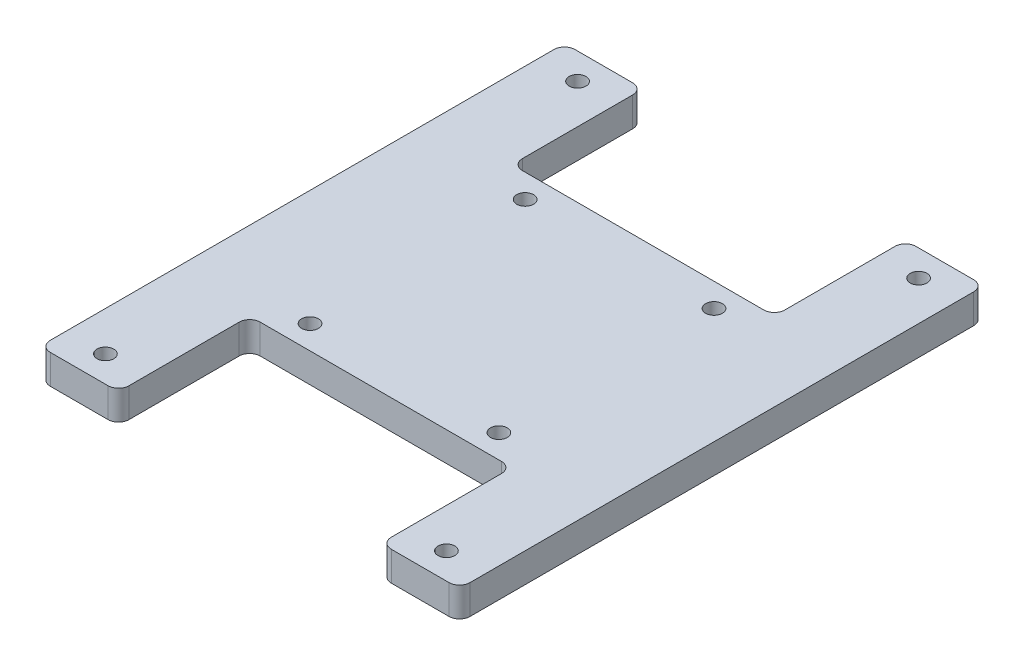
ISO-10303-21;
HEADER;
FILE_DESCRIPTION(('STEP AP214'),'2;1');
FILE_NAME('part.step','',(''),(''),'','','');
FILE_SCHEMA(('AUTOMOTIVE_DESIGN { 1 0 10303 214 1 1 1 1 }'));
ENDSEC;
DATA;
#1=APPLICATION_CONTEXT('core data for automotive mechanical design processes');
#2=APPLICATION_PROTOCOL_DEFINITION('international standard','automotive_design',2000,#1);
#3=PRODUCT_CONTEXT('',#1,'mechanical');
#4=PRODUCT('Part','Part','',(#3));
#5=PRODUCT_RELATED_PRODUCT_CATEGORY('part','',(#4));
#6=PRODUCT_DEFINITION_FORMATION('','',#4);
#7=PRODUCT_DEFINITION_CONTEXT('part definition',#1,'design');
#8=PRODUCT_DEFINITION('design','',#6,#7);
#9=PRODUCT_DEFINITION_SHAPE('','',#8);
#10=(LENGTH_UNIT() NAMED_UNIT(*) SI_UNIT(.MILLI.,.METRE.));
#11=(NAMED_UNIT(*) PLANE_ANGLE_UNIT() SI_UNIT($,.RADIAN.));
#12=(NAMED_UNIT(*) SI_UNIT($,.STERADIAN.) SOLID_ANGLE_UNIT());
#13=UNCERTAINTY_MEASURE_WITH_UNIT(LENGTH_MEASURE(1.E-05),#10,'distance_accuracy_value','');
#14=(GEOMETRIC_REPRESENTATION_CONTEXT(3) GLOBAL_UNCERTAINTY_ASSIGNED_CONTEXT((#13)) GLOBAL_UNIT_ASSIGNED_CONTEXT((#10,
#11,#12)) REPRESENTATION_CONTEXT('',''));
#15=CARTESIAN_POINT('',(0.,0.,0.));
#16=DIRECTION('',(0.,0.,1.));
#17=DIRECTION('',(1.,0.,0.));
#18=AXIS2_PLACEMENT_3D('',#15,#16,#17);
#19=CARTESIAN_POINT('',(-25.,5.6,0.));
#20=DIRECTION('',(1.,0.,0.));
#21=DIRECTION('',(0.,0.,-1.));
#22=AXIS2_PLACEMENT_3D('',#19,#20,#21);
#23=PLANE('',#22);
#24=DIRECTION('',(0.,0.,1.));
#25=VECTOR('',#24,1.);
#26=CARTESIAN_POINT('',(-25.,0.,0.));
#27=LINE('',#26,#25);
#28=CARTESIAN_POINT('',(-25.,0.,27.));
#29=VERTEX_POINT('',#28);
#30=CARTESIAN_POINT('',(-25.,0.,48.));
#31=VERTEX_POINT('',#30);
#32=EDGE_CURVE('E330',#29,#31,#27,.T.);
#33=ORIENTED_EDGE('',*,*,#32,.F.);
#34=DIRECTION('',(0.,-1.,0.));
#35=VECTOR('',#34,1.);
#36=CARTESIAN_POINT('',(-25.,5.6,27.));
#37=LINE('',#36,#35);
#38=CARTESIAN_POINT('',(-25.,5.6,27.));
#39=VERTEX_POINT('',#38);
#40=EDGE_CURVE('E314',#29,#39,#37,.F.);
#41=ORIENTED_EDGE('',*,*,#40,.T.);
#42=DIRECTION('',(0.,0.,1.));
#43=VECTOR('',#42,1.);
#44=CARTESIAN_POINT('',(-25.,5.6,0.));
#45=LINE('',#44,#43);
#46=CARTESIAN_POINT('',(-25.,5.6,48.));
#47=VERTEX_POINT('',#46);
#48=EDGE_CURVE('E351',#39,#47,#45,.T.);
#49=ORIENTED_EDGE('',*,*,#48,.T.);
#50=DIRECTION('',(0.,-1.,0.));
#51=VECTOR('',#50,1.);
#52=CARTESIAN_POINT('',(-25.,0.,48.));
#53=LINE('',#52,#51);
#54=EDGE_CURVE('E311',#47,#31,#53,.T.);
#55=ORIENTED_EDGE('',*,*,#54,.T.);
#56=EDGE_LOOP('',(#33,#41,#49,#55));
#57=FACE_BOUND('',#56,.T.);
#58=ADVANCED_FACE('F37',(#57),#23,.T.);
#59=CARTESIAN_POINT('',(0.,5.6,25.));
#60=DIRECTION('',(0.,0.,-1.));
#61=DIRECTION('',(-1.,0.,0.));
#62=AXIS2_PLACEMENT_3D('',#59,#60,#61);
#63=PLANE('',#62);
#64=DIRECTION('',(1.,0.,0.));
#65=VECTOR('',#64,1.);
#66=CARTESIAN_POINT('',(0.,0.,25.));
#67=LINE('',#66,#65);
#68=CARTESIAN_POINT('',(-23.,0.,25.));
#69=VERTEX_POINT('',#68);
#70=CARTESIAN_POINT('',(23.,0.,25.));
#71=VERTEX_POINT('',#70);
#72=EDGE_CURVE('E332',#69,#71,#67,.T.);
#73=ORIENTED_EDGE('',*,*,#72,.T.);
#74=DIRECTION('',(0.,-1.,0.));
#75=VECTOR('',#74,1.);
#76=CARTESIAN_POINT('',(23.,5.6,25.));
#77=LINE('',#76,#75);
#78=CARTESIAN_POINT('',(23.,5.6,25.));
#79=VERTEX_POINT('',#78);
#80=EDGE_CURVE('E309',#71,#79,#77,.F.);
#81=ORIENTED_EDGE('',*,*,#80,.T.);
#82=DIRECTION('',(1.,0.,0.));
#83=VECTOR('',#82,1.);
#84=CARTESIAN_POINT('',(0.,5.6,25.));
#85=LINE('',#84,#83);
#86=CARTESIAN_POINT('',(-23.,5.6,25.));
#87=VERTEX_POINT('',#86);
#88=EDGE_CURVE('E349',#87,#79,#85,.T.);
#89=ORIENTED_EDGE('',*,*,#88,.F.);
#90=DIRECTION('',(0.,-1.,0.));
#91=VECTOR('',#90,1.);
#92=CARTESIAN_POINT('',(-23.,5.6,25.));
#93=LINE('',#92,#91);
#94=EDGE_CURVE('E306',#87,#69,#93,.T.);
#95=ORIENTED_EDGE('',*,*,#94,.T.);
#96=EDGE_LOOP('',(#73,#81,#89,#95));
#97=FACE_BOUND('',#96,.T.);
#98=ADVANCED_FACE('F353',(#97),#63,.F.);
#99=CARTESIAN_POINT('',(25.,5.6,0.));
#100=DIRECTION('',(1.,0.,0.));
#101=DIRECTION('',(0.,0.,-1.));
#102=AXIS2_PLACEMENT_3D('',#99,#100,#101);
#103=PLANE('',#102);
#104=DIRECTION('',(0.,0.,1.));
#105=VECTOR('',#104,1.);
#106=CARTESIAN_POINT('',(25.,0.,0.));
#107=LINE('',#106,#105);
#108=CARTESIAN_POINT('',(25.,0.,27.));
#109=VERTEX_POINT('',#108);
#110=CARTESIAN_POINT('',(25.,0.,48.));
#111=VERTEX_POINT('',#110);
#112=EDGE_CURVE('E392',#109,#111,#107,.T.);
#113=ORIENTED_EDGE('',*,*,#112,.T.);
#114=DIRECTION('',(0.,-1.,0.));
#115=VECTOR('',#114,1.);
#116=CARTESIAN_POINT('',(25.,5.6,48.));
#117=LINE('',#116,#115);
#118=CARTESIAN_POINT('',(25.,5.6,48.));
#119=VERTEX_POINT('',#118);
#120=EDGE_CURVE('E304',#111,#119,#117,.F.);
#121=ORIENTED_EDGE('',*,*,#120,.T.);
#122=DIRECTION('',(0.,0.,1.));
#123=VECTOR('',#122,1.);
#124=CARTESIAN_POINT('',(25.,5.6,0.));
#125=LINE('',#124,#123);
#126=CARTESIAN_POINT('',(25.,5.6,27.));
#127=VERTEX_POINT('',#126);
#128=EDGE_CURVE('E355',#127,#119,#125,.T.);
#129=ORIENTED_EDGE('',*,*,#128,.F.);
#130=DIRECTION('',(0.,-1.,0.));
#131=VECTOR('',#130,1.);
#132=CARTESIAN_POINT('',(25.,0.,27.));
#133=LINE('',#132,#131);
#134=EDGE_CURVE('E301',#127,#109,#133,.T.);
#135=ORIENTED_EDGE('',*,*,#134,.T.);
#136=EDGE_LOOP('',(#113,#121,#129,#135));
#137=FACE_BOUND('',#136,.T.);
#138=ADVANCED_FACE('F488',(#137),#103,.F.);
#139=CARTESIAN_POINT('',(0.,5.6,50.));
#140=DIRECTION('',(0.,0.,-1.));
#141=DIRECTION('',(-1.,0.,0.));
#142=AXIS2_PLACEMENT_3D('',#139,#140,#141);
#143=PLANE('',#142);
#144=DIRECTION('',(1.,0.,0.));
#145=VECTOR('',#144,1.);
#146=CARTESIAN_POINT('',(0.,5.6,50.));
#147=LINE('',#146,#145);
#148=CARTESIAN_POINT('',(27.,5.6,50.));
#149=VERTEX_POINT('',#148);
#150=CARTESIAN_POINT('',(38.,5.6,50.));
#151=VERTEX_POINT('',#150);
#152=EDGE_CURVE('E358',#149,#151,#147,.T.);
#153=ORIENTED_EDGE('',*,*,#152,.F.);
#154=DIRECTION('',(0.,-1.,0.));
#155=VECTOR('',#154,1.);
#156=CARTESIAN_POINT('',(27.,5.6,50.));
#157=LINE('',#156,#155);
#158=CARTESIAN_POINT('',(27.,0.,50.));
#159=VERTEX_POINT('',#158);
#160=EDGE_CURVE('E298',#149,#159,#157,.T.);
#161=ORIENTED_EDGE('',*,*,#160,.T.);
#162=DIRECTION('',(1.,0.,0.));
#163=VECTOR('',#162,1.);
#164=CARTESIAN_POINT('',(0.,0.,50.));
#165=LINE('',#164,#163);
#166=CARTESIAN_POINT('',(38.,0.,50.));
#167=VERTEX_POINT('',#166);
#168=EDGE_CURVE('E395',#159,#167,#165,.T.);
#169=ORIENTED_EDGE('',*,*,#168,.T.);
#170=DIRECTION('',(0.,-1.,0.));
#171=VECTOR('',#170,1.);
#172=CARTESIAN_POINT('',(38.,5.6,50.));
#173=LINE('',#172,#171);
#174=EDGE_CURVE('E296',#167,#151,#173,.F.);
#175=ORIENTED_EDGE('',*,*,#174,.T.);
#176=EDGE_LOOP('',(#153,#161,#169,#175));
#177=FACE_BOUND('',#176,.T.);
#178=ADVANCED_FACE('F479',(#177),#143,.F.);
#179=CARTESIAN_POINT('',(40.,5.6,0.));
#180=DIRECTION('',(1.,0.,0.));
#181=DIRECTION('',(0.,0.,-1.));
#182=AXIS2_PLACEMENT_3D('',#179,#180,#181);
#183=PLANE('',#182);
#184=DIRECTION('',(0.,0.,1.));
#185=VECTOR('',#184,1.);
#186=CARTESIAN_POINT('',(40.,0.,0.));
#187=LINE('',#186,#185);
#188=CARTESIAN_POINT('',(40.,0.,-48.));
#189=VERTEX_POINT('',#188);
#190=CARTESIAN_POINT('',(40.,0.,48.));
#191=VERTEX_POINT('',#190);
#192=EDGE_CURVE('E398',#189,#191,#187,.T.);
#193=ORIENTED_EDGE('',*,*,#192,.F.);
#194=DIRECTION('',(0.,-1.,0.));
#195=VECTOR('',#194,1.);
#196=CARTESIAN_POINT('',(40.,5.6,-48.));
#197=LINE('',#196,#195);
#198=CARTESIAN_POINT('',(40.,5.6,-48.));
#199=VERTEX_POINT('',#198);
#200=EDGE_CURVE('E294',#189,#199,#197,.F.);
#201=ORIENTED_EDGE('',*,*,#200,.T.);
#202=DIRECTION('',(0.,0.,1.));
#203=VECTOR('',#202,1.);
#204=CARTESIAN_POINT('',(40.,5.6,0.));
#205=LINE('',#204,#203);
#206=CARTESIAN_POINT('',(40.,5.6,48.));
#207=VERTEX_POINT('',#206);
#208=EDGE_CURVE('E367',#199,#207,#205,.T.);
#209=ORIENTED_EDGE('',*,*,#208,.T.);
#210=DIRECTION('',(0.,-1.,0.));
#211=VECTOR('',#210,1.);
#212=CARTESIAN_POINT('',(40.,0.,48.));
#213=LINE('',#212,#211);
#214=EDGE_CURVE('E291',#207,#191,#213,.T.);
#215=ORIENTED_EDGE('',*,*,#214,.T.);
#216=EDGE_LOOP('',(#193,#201,#209,#215));
#217=FACE_BOUND('',#216,.T.);
#218=ADVANCED_FACE('F469',(#217),#183,.T.);
#219=CARTESIAN_POINT('',(0.,5.6,-50.));
#220=DIRECTION('',(0.,0.,-1.));
#221=DIRECTION('',(-1.,0.,0.));
#222=AXIS2_PLACEMENT_3D('',#219,#220,#221);
#223=PLANE('',#222);
#224=DIRECTION('',(1.,0.,0.));
#225=VECTOR('',#224,1.);
#226=CARTESIAN_POINT('',(0.,0.,-50.));
#227=LINE('',#226,#225);
#228=CARTESIAN_POINT('',(27.,0.,-50.));
#229=VERTEX_POINT('',#228);
#230=CARTESIAN_POINT('',(38.,0.,-50.));
#231=VERTEX_POINT('',#230);
#232=EDGE_CURVE('E402',#229,#231,#227,.T.);
#233=ORIENTED_EDGE('',*,*,#232,.F.);
#234=DIRECTION('',(0.,-1.,0.));
#235=VECTOR('',#234,1.);
#236=CARTESIAN_POINT('',(27.,5.6,-50.));
#237=LINE('',#236,#235);
#238=CARTESIAN_POINT('',(27.,5.6,-50.));
#239=VERTEX_POINT('',#238);
#240=EDGE_CURVE('E289',#229,#239,#237,.F.);
#241=ORIENTED_EDGE('',*,*,#240,.T.);
#242=DIRECTION('',(1.,0.,0.));
#243=VECTOR('',#242,1.);
#244=CARTESIAN_POINT('',(0.,5.6,-50.));
#245=LINE('',#244,#243);
#246=CARTESIAN_POINT('',(38.,5.6,-50.));
#247=VERTEX_POINT('',#246);
#248=EDGE_CURVE('E370',#239,#247,#245,.T.);
#249=ORIENTED_EDGE('',*,*,#248,.T.);
#250=DIRECTION('',(0.,-1.,0.));
#251=VECTOR('',#250,1.);
#252=CARTESIAN_POINT('',(38.,5.6,-50.));
#253=LINE('',#252,#251);
#254=EDGE_CURVE('E286',#247,#231,#253,.T.);
#255=ORIENTED_EDGE('',*,*,#254,.T.);
#256=EDGE_LOOP('',(#233,#241,#249,#255));
#257=FACE_BOUND('',#256,.T.);
#258=ADVANCED_FACE('F460',(#257),#223,.T.);
#259=CARTESIAN_POINT('',(25.,5.6,0.));
#260=DIRECTION('',(-1.,0.,0.));
#261=DIRECTION('',(0.,0.,1.));
#262=AXIS2_PLACEMENT_3D('',#259,#260,#261);
#263=PLANE('',#262);
#264=DIRECTION('',(0.,0.,-1.));
#265=VECTOR('',#264,1.);
#266=CARTESIAN_POINT('',(25.,0.,0.));
#267=LINE('',#266,#265);
#268=CARTESIAN_POINT('',(25.,0.,-27.));
#269=VERTEX_POINT('',#268);
#270=CARTESIAN_POINT('',(25.,0.,-48.));
#271=VERTEX_POINT('',#270);
#272=EDGE_CURVE('E222',#269,#271,#267,.T.);
#273=ORIENTED_EDGE('',*,*,#272,.F.);
#274=DIRECTION('',(0.,-1.,0.));
#275=VECTOR('',#274,1.);
#276=CARTESIAN_POINT('',(25.,5.6,-27.));
#277=LINE('',#276,#275);
#278=CARTESIAN_POINT('',(25.,5.6,-27.));
#279=VERTEX_POINT('',#278);
#280=EDGE_CURVE('E239',#269,#279,#277,.F.);
#281=ORIENTED_EDGE('',*,*,#280,.T.);
#282=DIRECTION('',(0.,0.,-1.));
#283=VECTOR('',#282,1.);
#284=CARTESIAN_POINT('',(25.,5.6,0.));
#285=LINE('',#284,#283);
#286=CARTESIAN_POINT('',(25.,5.6,-48.));
#287=VERTEX_POINT('',#286);
#288=EDGE_CURVE('E373',#279,#287,#285,.T.);
#289=ORIENTED_EDGE('',*,*,#288,.T.);
#290=DIRECTION('',(0.,-1.,0.));
#291=VECTOR('',#290,1.);
#292=CARTESIAN_POINT('',(25.,5.6,-48.));
#293=LINE('',#292,#291);
#294=EDGE_CURVE('E228',#287,#271,#293,.T.);
#295=ORIENTED_EDGE('',*,*,#294,.T.);
#296=EDGE_LOOP('',(#273,#281,#289,#295));
#297=FACE_BOUND('',#296,.T.);
#298=ADVANCED_FACE('F452',(#297),#263,.T.);
#299=CARTESIAN_POINT('',(0.,5.6,-25.));
#300=DIRECTION('',(0.,0.,-1.));
#301=DIRECTION('',(-1.,0.,0.));
#302=AXIS2_PLACEMENT_3D('',#299,#300,#301);
#303=PLANE('',#302);
#304=DIRECTION('',(1.,0.,0.));
#305=VECTOR('',#304,1.);
#306=CARTESIAN_POINT('',(0.,5.6,-25.));
#307=LINE('',#306,#305);
#308=CARTESIAN_POINT('',(-23.,5.6,-25.));
#309=VERTEX_POINT('',#308);
#310=CARTESIAN_POINT('',(23.,5.6,-25.));
#311=VERTEX_POINT('',#310);
#312=EDGE_CURVE('E377',#309,#311,#307,.T.);
#313=ORIENTED_EDGE('',*,*,#312,.T.);
#314=DIRECTION('',(0.,-1.,0.));
#315=VECTOR('',#314,1.);
#316=CARTESIAN_POINT('',(23.,0.,-25.));
#317=LINE('',#316,#315);
#318=CARTESIAN_POINT('',(23.,0.,-25.));
#319=VERTEX_POINT('',#318);
#320=EDGE_CURVE('E221',#311,#319,#317,.T.);
#321=ORIENTED_EDGE('',*,*,#320,.T.);
#322=DIRECTION('',(1.,0.,0.));
#323=VECTOR('',#322,1.);
#324=CARTESIAN_POINT('',(0.,0.,-25.));
#325=LINE('',#324,#323);
#326=CARTESIAN_POINT('',(-23.,0.,-25.));
#327=VERTEX_POINT('',#326);
#328=EDGE_CURVE('E204',#327,#319,#325,.T.);
#329=ORIENTED_EDGE('',*,*,#328,.F.);
#330=DIRECTION('',(0.,-1.,0.));
#331=VECTOR('',#330,1.);
#332=CARTESIAN_POINT('',(-23.,5.6,-25.));
#333=LINE('',#332,#331);
#334=EDGE_CURVE('E218',#327,#309,#333,.F.);
#335=ORIENTED_EDGE('',*,*,#334,.T.);
#336=EDGE_LOOP('',(#313,#321,#329,#335));
#337=FACE_BOUND('',#336,.T.);
#338=ADVANCED_FACE('F217',(#337),#303,.T.);
#339=CARTESIAN_POINT('',(-25.,5.6,0.));
#340=DIRECTION('',(-1.,0.,0.));
#341=DIRECTION('',(0.,0.,1.));
#342=AXIS2_PLACEMENT_3D('',#339,#340,#341);
#343=PLANE('',#342);
#344=DIRECTION('',(0.,0.,-1.));
#345=VECTOR('',#344,1.);
#346=CARTESIAN_POINT('',(-25.,0.,0.));
#347=LINE('',#346,#345);
#348=CARTESIAN_POINT('',(-25.,0.,-27.));
#349=VERTEX_POINT('',#348);
#350=CARTESIAN_POINT('',(-25.,0.,-48.));
#351=VERTEX_POINT('',#350);
#352=EDGE_CURVE('E206',#349,#351,#347,.T.);
#353=ORIENTED_EDGE('',*,*,#352,.T.);
#354=DIRECTION('',(0.,-1.,0.));
#355=VECTOR('',#354,1.);
#356=CARTESIAN_POINT('',(-25.,5.6,-48.));
#357=LINE('',#356,#355);
#358=CARTESIAN_POINT('',(-25.,5.6,-48.));
#359=VERTEX_POINT('',#358);
#360=EDGE_CURVE('E284',#351,#359,#357,.F.);
#361=ORIENTED_EDGE('',*,*,#360,.T.);
#362=DIRECTION('',(0.,0.,-1.));
#363=VECTOR('',#362,1.);
#364=CARTESIAN_POINT('',(-25.,5.6,0.));
#365=LINE('',#364,#363);
#366=CARTESIAN_POINT('',(-25.,5.6,-27.));
#367=VERTEX_POINT('',#366);
#368=EDGE_CURVE('E379',#367,#359,#365,.T.);
#369=ORIENTED_EDGE('',*,*,#368,.F.);
#370=DIRECTION('',(0.,-1.,0.));
#371=VECTOR('',#370,1.);
#372=CARTESIAN_POINT('',(-25.,5.6,-27.));
#373=LINE('',#372,#371);
#374=EDGE_CURVE('E282',#367,#349,#373,.T.);
#375=ORIENTED_EDGE('',*,*,#374,.T.);
#376=EDGE_LOOP('',(#353,#361,#369,#375));
#377=FACE_BOUND('',#376,.T.);
#378=ADVANCED_FACE('F443',(#377),#343,.F.);
#379=CARTESIAN_POINT('',(-38.,0.,-50.));
#380=VERTEX_POINT('',#379);
#381=CARTESIAN_POINT('',(-27.,0.,-50.));
#382=VERTEX_POINT('',#381);
#383=EDGE_CURVE('E405',#380,#382,#227,.T.);
#384=ORIENTED_EDGE('',*,*,#383,.F.);
#385=DIRECTION('',(0.,-1.,0.));
#386=VECTOR('',#385,1.);
#387=CARTESIAN_POINT('',(-38.,5.6,-50.));
#388=LINE('',#387,#386);
#389=CARTESIAN_POINT('',(-38.,5.6,-50.));
#390=VERTEX_POINT('',#389);
#391=EDGE_CURVE('E265',#380,#390,#388,.F.);
#392=ORIENTED_EDGE('',*,*,#391,.T.);
#393=CARTESIAN_POINT('',(-27.,5.6,-50.));
#394=VERTEX_POINT('',#393);
#395=EDGE_CURVE('E374',#390,#394,#245,.T.);
#396=ORIENTED_EDGE('',*,*,#395,.T.);
#397=DIRECTION('',(0.,-1.,0.));
#398=VECTOR('',#397,1.);
#399=CARTESIAN_POINT('',(-27.,0.,-50.));
#400=LINE('',#399,#398);
#401=EDGE_CURVE('E262',#394,#382,#400,.T.);
#402=ORIENTED_EDGE('',*,*,#401,.T.);
#403=EDGE_LOOP('',(#384,#392,#396,#402));
#404=FACE_BOUND('',#403,.T.);
#405=ADVANCED_FACE('F435',(#404),#223,.T.);
#406=CARTESIAN_POINT('',(-40.,5.6,0.));
#407=DIRECTION('',(1.,0.,0.));
#408=DIRECTION('',(0.,0.,-1.));
#409=AXIS2_PLACEMENT_3D('',#406,#407,#408);
#410=PLANE('',#409);
#411=DIRECTION('',(0.,0.,1.));
#412=VECTOR('',#411,1.);
#413=CARTESIAN_POINT('',(-40.,5.6,0.));
#414=LINE('',#413,#412);
#415=CARTESIAN_POINT('',(-40.,5.6,-48.));
#416=VERTEX_POINT('',#415);
#417=CARTESIAN_POINT('',(-40.,5.6,48.));
#418=VERTEX_POINT('',#417);
#419=EDGE_CURVE('E366',#416,#418,#414,.T.);
#420=ORIENTED_EDGE('',*,*,#419,.F.);
#421=DIRECTION('',(0.,-1.,0.));
#422=VECTOR('',#421,1.);
#423=CARTESIAN_POINT('',(-40.,0.,-48.));
#424=LINE('',#423,#422);
#425=CARTESIAN_POINT('',(-40.,0.,-48.));
#426=VERTEX_POINT('',#425);
#427=EDGE_CURVE('E243',#416,#426,#424,.T.);
#428=ORIENTED_EDGE('',*,*,#427,.T.);
#429=DIRECTION('',(0.,0.,1.));
#430=VECTOR('',#429,1.);
#431=CARTESIAN_POINT('',(-40.,0.,0.));
#432=LINE('',#431,#430);
#433=CARTESIAN_POINT('',(-40.,0.,48.));
#434=VERTEX_POINT('',#433);
#435=EDGE_CURVE('E409',#426,#434,#432,.T.);
#436=ORIENTED_EDGE('',*,*,#435,.T.);
#437=DIRECTION('',(0.,-1.,0.));
#438=VECTOR('',#437,1.);
#439=CARTESIAN_POINT('',(-40.,5.6,48.));
#440=LINE('',#439,#438);
#441=EDGE_CURVE('E241',#434,#418,#440,.F.);
#442=ORIENTED_EDGE('',*,*,#441,.T.);
#443=EDGE_LOOP('',(#420,#428,#436,#442));
#444=FACE_BOUND('',#443,.T.);
#445=ADVANCED_FACE('F426',(#444),#410,.F.);
#446=CARTESIAN_POINT('',(-32.5,5.6,45.));
#447=DIRECTION('',(0.,-1.,0.));
#448=DIRECTION('',(0.,0.,-1.));
#449=AXIS2_PLACEMENT_3D('',#446,#447,#448);
#450=CYLINDRICAL_SURFACE('',#449,1.60000000000001);
#451=CARTESIAN_POINT('',(-32.5,5.6,45.));
#452=DIRECTION('',(0.,1.,0.));
#453=DIRECTION('',(0.,0.,1.));
#454=AXIS2_PLACEMENT_3D('',#451,#452,#453);
#455=CIRCLE('',#454,1.60000000000001);
#456=CARTESIAN_POINT('',(-32.5,5.6,46.6));
#457=VERTEX_POINT('',#456);
#458=EDGE_CURVE('E231',#457,#457,#455,.T.);
#459=ORIENTED_EDGE('',*,*,#458,.T.);
#460=EDGE_LOOP('',(#459));
#461=FACE_BOUND('',#460,.T.);
#462=CARTESIAN_POINT('',(-32.5,0.,45.));
#463=DIRECTION('',(0.,1.,0.));
#464=DIRECTION('',(0.,0.,1.));
#465=AXIS2_PLACEMENT_3D('',#462,#463,#464);
#466=CIRCLE('',#465,1.60000000000001);
#467=CARTESIAN_POINT('',(-32.5,0.,46.6));
#468=VERTEX_POINT('',#467);
#469=EDGE_CURVE('E411',#468,#468,#466,.T.);
#470=ORIENTED_EDGE('',*,*,#469,.F.);
#471=EDGE_LOOP('',(#470));
#472=FACE_BOUND('',#471,.T.);
#473=ADVANCED_FACE('F676',(#461,#472),#450,.F.);
#474=CARTESIAN_POINT('',(-38.,0.,50.));
#475=VERTEX_POINT('',#474);
#476=CARTESIAN_POINT('',(-27.,0.,50.));
#477=VERTEX_POINT('',#476);
#478=EDGE_CURVE('E399',#475,#477,#165,.T.);
#479=ORIENTED_EDGE('',*,*,#478,.T.);
#480=DIRECTION('',(0.,-1.,0.));
#481=VECTOR('',#480,1.);
#482=CARTESIAN_POINT('',(-27.,5.6,50.));
#483=LINE('',#482,#481);
#484=CARTESIAN_POINT('',(-27.,5.6,50.));
#485=VERTEX_POINT('',#484);
#486=EDGE_CURVE('E52',#477,#485,#483,.F.);
#487=ORIENTED_EDGE('',*,*,#486,.T.);
#488=CARTESIAN_POINT('',(-38.,5.6,50.));
#489=VERTEX_POINT('',#488);
#490=EDGE_CURVE('E364',#489,#485,#147,.T.);
#491=ORIENTED_EDGE('',*,*,#490,.F.);
#492=DIRECTION('',(0.,-1.,0.));
#493=VECTOR('',#492,1.);
#494=CARTESIAN_POINT('',(-38.,5.6,50.));
#495=LINE('',#494,#493);
#496=EDGE_CURVE('E316',#489,#475,#495,.T.);
#497=ORIENTED_EDGE('',*,*,#496,.T.);
#498=EDGE_LOOP('',(#479,#487,#491,#497));
#499=FACE_BOUND('',#498,.T.);
#500=ADVANCED_FACE('F417',(#499),#143,.F.);
#501=CARTESIAN_POINT('',(32.5,5.6,-45.));
#502=DIRECTION('',(0.,-1.,0.));
#503=DIRECTION('',(0.,0.,-1.));
#504=AXIS2_PLACEMENT_3D('',#501,#502,#503);
#505=CYLINDRICAL_SURFACE('',#504,1.60000000000001);
#506=CARTESIAN_POINT('',(32.5,5.6,-45.));
#507=DIRECTION('',(0.,1.,0.));
#508=DIRECTION('',(0.,0.,1.));
#509=AXIS2_PLACEMENT_3D('',#506,#507,#508);
#510=CIRCLE('',#509,1.60000000000001);
#511=CARTESIAN_POINT('',(32.5,5.6,-43.4));
#512=VERTEX_POINT('',#511);
#513=EDGE_CURVE('E360',#512,#512,#510,.T.);
#514=ORIENTED_EDGE('',*,*,#513,.T.);
#515=EDGE_LOOP('',(#514));
#516=FACE_BOUND('',#515,.T.);
#517=CARTESIAN_POINT('',(32.5,0.,-45.));
#518=DIRECTION('',(0.,1.,0.));
#519=DIRECTION('',(0.,0.,1.));
#520=AXIS2_PLACEMENT_3D('',#517,#518,#519);
#521=CIRCLE('',#520,1.60000000000001);
#522=CARTESIAN_POINT('',(32.5,0.,-43.4));
#523=VERTEX_POINT('',#522);
#524=EDGE_CURVE('E340',#523,#523,#521,.T.);
#525=ORIENTED_EDGE('',*,*,#524,.F.);
#526=EDGE_LOOP('',(#525));
#527=FACE_BOUND('',#526,.T.);
#528=ADVANCED_FACE('F509',(#516,#527),#505,.F.);
#529=CARTESIAN_POINT('',(-32.5,5.6,-45.));
#530=DIRECTION('',(0.,-1.,0.));
#531=DIRECTION('',(0.,0.,-1.));
#532=AXIS2_PLACEMENT_3D('',#529,#530,#531);
#533=CYLINDRICAL_SURFACE('',#532,1.60000000000001);
#534=CARTESIAN_POINT('',(-32.5,5.6,-45.));
#535=DIRECTION('',(0.,1.,0.));
#536=DIRECTION('',(0.,0.,1.));
#537=AXIS2_PLACEMENT_3D('',#534,#535,#536);
#538=CIRCLE('',#537,1.60000000000001);
#539=CARTESIAN_POINT('',(-32.5,5.6,-43.4));
#540=VERTEX_POINT('',#539);
#541=EDGE_CURVE('E415',#540,#540,#538,.F.);
#542=ORIENTED_EDGE('',*,*,#541,.F.);
#543=EDGE_LOOP('',(#542));
#544=FACE_BOUND('',#543,.T.);
#545=CARTESIAN_POINT('',(-32.5,0.,-45.));
#546=DIRECTION('',(0.,1.,0.));
#547=DIRECTION('',(0.,0.,1.));
#548=AXIS2_PLACEMENT_3D('',#545,#546,#547);
#549=CIRCLE('',#548,1.60000000000001);
#550=CARTESIAN_POINT('',(-32.5,0.,-43.4));
#551=VERTEX_POINT('',#550);
#552=EDGE_CURVE('E385',#551,#551,#549,.F.);
#553=ORIENTED_EDGE('',*,*,#552,.T.);
#554=EDGE_LOOP('',(#553));
#555=FACE_BOUND('',#554,.T.);
#556=ADVANCED_FACE('F512',(#544,#555),#533,.F.);
#557=CARTESIAN_POINT('',(32.5,5.6,45.));
#558=DIRECTION('',(0.,-1.,0.));
#559=DIRECTION('',(0.,0.,-1.));
#560=AXIS2_PLACEMENT_3D('',#557,#558,#559);
#561=CYLINDRICAL_SURFACE('',#560,1.60000000000001);
#562=CARTESIAN_POINT('',(32.5,5.6,45.));
#563=DIRECTION('',(0.,1.,0.));
#564=DIRECTION('',(0.,0.,1.));
#565=AXIS2_PLACEMENT_3D('',#562,#563,#564);
#566=CIRCLE('',#565,1.60000000000001);
#567=CARTESIAN_POINT('',(32.5,5.6,46.6));
#568=VERTEX_POINT('',#567);
#569=EDGE_CURVE('E226',#568,#568,#566,.F.);
#570=ORIENTED_EDGE('',*,*,#569,.F.);
#571=EDGE_LOOP('',(#570));
#572=FACE_BOUND('',#571,.T.);
#573=CARTESIAN_POINT('',(32.5,0.,45.));
#574=DIRECTION('',(0.,1.,0.));
#575=DIRECTION('',(0.,0.,1.));
#576=AXIS2_PLACEMENT_3D('',#573,#574,#575);
#577=CIRCLE('',#576,1.60000000000001);
#578=CARTESIAN_POINT('',(32.5,0.,46.6));
#579=VERTEX_POINT('',#578);
#580=EDGE_CURVE('E234',#579,#579,#577,.F.);
#581=ORIENTED_EDGE('',*,*,#580,.T.);
#582=EDGE_LOOP('',(#581));
#583=FACE_BOUND('',#582,.T.);
#584=ADVANCED_FACE('F516',(#572,#583),#561,.F.);
#585=CARTESIAN_POINT('',(0.,5.6,0.));
#586=DIRECTION('',(0.,1.,0.));
#587=DIRECTION('',(0.,0.,1.));
#588=AXIS2_PLACEMENT_3D('',#585,#586,#587);
#589=PLANE('',#588);
#590=CARTESIAN_POINT('',(-18.,5.6,-20.5));
#591=DIRECTION('',(0.,1.,0.));
#592=DIRECTION('',(0.,0.,-1.));
#593=AXIS2_PLACEMENT_3D('',#590,#591,#592);
#594=CIRCLE('',#593,1.6);
#595=CARTESIAN_POINT('',(-18.,5.6,-22.1));
#596=VERTEX_POINT('',#595);
#597=EDGE_CURVE('E795',#596,#596,#594,.T.);
#598=ORIENTED_EDGE('',*,*,#597,.F.);
#599=EDGE_LOOP('',(#598));
#600=FACE_BOUND('',#599,.T.);
#601=CARTESIAN_POINT('',(-18.,5.6,20.5));
#602=DIRECTION('',(0.,1.,0.));
#603=DIRECTION('',(0.,0.,1.));
#604=AXIS2_PLACEMENT_3D('',#601,#602,#603);
#605=CIRCLE('',#604,1.60000000000002);
#606=CARTESIAN_POINT('',(-18.,5.6,22.1));
#607=VERTEX_POINT('',#606);
#608=EDGE_CURVE('E799',#607,#607,#605,.T.);
#609=ORIENTED_EDGE('',*,*,#608,.F.);
#610=EDGE_LOOP('',(#609));
#611=FACE_BOUND('',#610,.T.);
#612=CARTESIAN_POINT('',(18.,5.6,20.5));
#613=DIRECTION('',(0.,1.,0.));
#614=DIRECTION('',(0.,0.,-1.));
#615=AXIS2_PLACEMENT_3D('',#612,#613,#614);
#616=CIRCLE('',#615,1.6);
#617=CARTESIAN_POINT('',(18.,5.6,18.9));
#618=VERTEX_POINT('',#617);
#619=EDGE_CURVE('E803',#618,#618,#616,.T.);
#620=ORIENTED_EDGE('',*,*,#619,.F.);
#621=EDGE_LOOP('',(#620));
#622=FACE_BOUND('',#621,.T.);
#623=CARTESIAN_POINT('',(18.,5.6,-20.5));
#624=DIRECTION('',(0.,1.,0.));
#625=DIRECTION('',(0.,0.,1.));
#626=AXIS2_PLACEMENT_3D('',#623,#624,#625);
#627=CIRCLE('',#626,1.6);
#628=CARTESIAN_POINT('',(18.,5.6,-18.9));
#629=VERTEX_POINT('',#628);
#630=EDGE_CURVE('E807',#629,#629,#627,.T.);
#631=ORIENTED_EDGE('',*,*,#630,.F.);
#632=EDGE_LOOP('',(#631));
#633=FACE_BOUND('',#632,.T.);
#634=ORIENTED_EDGE('',*,*,#541,.T.);
#635=EDGE_LOOP('',(#634));
#636=FACE_BOUND('',#635,.T.);
#637=ORIENTED_EDGE('',*,*,#513,.F.);
#638=EDGE_LOOP('',(#637));
#639=FACE_BOUND('',#638,.T.);
#640=ORIENTED_EDGE('',*,*,#395,.F.);
#641=CARTESIAN_POINT('',(-38.,5.6,-48.));
#642=DIRECTION('',(0.,1.,0.));
#643=DIRECTION('',(0.,0.,1.));
#644=AXIS2_PLACEMENT_3D('',#641,#642,#643);
#645=CIRCLE('',#644,2.);
#646=EDGE_CURVE('E280',#390,#416,#645,.T.);
#647=ORIENTED_EDGE('',*,*,#646,.T.);
#648=ORIENTED_EDGE('',*,*,#419,.T.);
#649=CARTESIAN_POINT('',(-38.,5.6,48.));
#650=DIRECTION('',(0.,1.,0.));
#651=DIRECTION('',(0.,0.,1.));
#652=AXIS2_PLACEMENT_3D('',#649,#650,#651);
#653=CIRCLE('',#652,2.);
#654=EDGE_CURVE('E59',#418,#489,#653,.T.);
#655=ORIENTED_EDGE('',*,*,#654,.T.);
#656=ORIENTED_EDGE('',*,*,#490,.T.);
#657=CARTESIAN_POINT('',(-27.,5.6,48.));
#658=DIRECTION('',(0.,1.,0.));
#659=DIRECTION('',(0.,0.,1.));
#660=AXIS2_PLACEMENT_3D('',#657,#658,#659);
#661=CIRCLE('',#660,2.);
#662=EDGE_CURVE('E268',#485,#47,#661,.T.);
#663=ORIENTED_EDGE('',*,*,#662,.T.);
#664=ORIENTED_EDGE('',*,*,#48,.F.);
#665=CARTESIAN_POINT('',(-23.,5.6,27.));
#666=DIRECTION('',(0.,1.,0.));
#667=DIRECTION('',(0.,0.,1.));
#668=AXIS2_PLACEMENT_3D('',#665,#666,#667);
#669=CIRCLE('',#668,2.);
#670=EDGE_CURVE('E11',#39,#87,#669,.F.);
#671=ORIENTED_EDGE('',*,*,#670,.T.);
#672=ORIENTED_EDGE('',*,*,#88,.T.);
#673=CARTESIAN_POINT('',(23.,5.6,27.));
#674=DIRECTION('',(0.,1.,0.));
#675=DIRECTION('',(0.,0.,1.));
#676=AXIS2_PLACEMENT_3D('',#673,#674,#675);
#677=CIRCLE('',#676,2.);
#678=EDGE_CURVE('E326',#79,#127,#677,.F.);
#679=ORIENTED_EDGE('',*,*,#678,.T.);
#680=ORIENTED_EDGE('',*,*,#128,.T.);
#681=CARTESIAN_POINT('',(27.,5.6,48.));
#682=DIRECTION('',(0.,1.,0.));
#683=DIRECTION('',(0.,0.,1.));
#684=AXIS2_PLACEMENT_3D('',#681,#682,#683);
#685=CIRCLE('',#684,2.);
#686=EDGE_CURVE('E272',#119,#149,#685,.T.);
#687=ORIENTED_EDGE('',*,*,#686,.T.);
#688=ORIENTED_EDGE('',*,*,#152,.T.);
#689=CARTESIAN_POINT('',(38.,5.6,48.));
#690=DIRECTION('',(0.,1.,0.));
#691=DIRECTION('',(0.,0.,1.));
#692=AXIS2_PLACEMENT_3D('',#689,#690,#691);
#693=CIRCLE('',#692,2.);
#694=EDGE_CURVE('E270',#151,#207,#693,.T.);
#695=ORIENTED_EDGE('',*,*,#694,.T.);
#696=ORIENTED_EDGE('',*,*,#208,.F.);
#697=CARTESIAN_POINT('',(38.,5.6,-48.));
#698=DIRECTION('',(0.,1.,0.));
#699=DIRECTION('',(0.,0.,1.));
#700=AXIS2_PLACEMENT_3D('',#697,#698,#699);
#701=CIRCLE('',#700,2.);
#702=EDGE_CURVE('E274',#199,#247,#701,.T.);
#703=ORIENTED_EDGE('',*,*,#702,.T.);
#704=ORIENTED_EDGE('',*,*,#248,.F.);
#705=CARTESIAN_POINT('',(27.,5.6,-48.));
#706=DIRECTION('',(0.,1.,0.));
#707=DIRECTION('',(0.,0.,1.));
#708=AXIS2_PLACEMENT_3D('',#705,#706,#707);
#709=CIRCLE('',#708,2.);
#710=EDGE_CURVE('E276',#239,#287,#709,.T.);
#711=ORIENTED_EDGE('',*,*,#710,.T.);
#712=ORIENTED_EDGE('',*,*,#288,.F.);
#713=CARTESIAN_POINT('',(23.,5.6,-27.));
#714=DIRECTION('',(0.,1.,0.));
#715=DIRECTION('',(0.,0.,1.));
#716=AXIS2_PLACEMENT_3D('',#713,#714,#715);
#717=CIRCLE('',#716,2.);
#718=EDGE_CURVE('E212',#279,#311,#717,.F.);
#719=ORIENTED_EDGE('',*,*,#718,.T.);
#720=ORIENTED_EDGE('',*,*,#312,.F.);
#721=CARTESIAN_POINT('',(-23.,5.6,-27.));
#722=DIRECTION('',(0.,1.,0.));
#723=DIRECTION('',(0.,0.,1.));
#724=AXIS2_PLACEMENT_3D('',#721,#722,#723);
#725=CIRCLE('',#724,2.);
#726=EDGE_CURVE('E211',#309,#367,#725,.F.);
#727=ORIENTED_EDGE('',*,*,#726,.T.);
#728=ORIENTED_EDGE('',*,*,#368,.T.);
#729=CARTESIAN_POINT('',(-27.,5.6,-48.));
#730=DIRECTION('',(0.,1.,0.));
#731=DIRECTION('',(0.,0.,1.));
#732=AXIS2_PLACEMENT_3D('',#729,#730,#731);
#733=CIRCLE('',#732,2.);
#734=EDGE_CURVE('E278',#359,#394,#733,.T.);
#735=ORIENTED_EDGE('',*,*,#734,.T.);
#736=EDGE_LOOP('',(#640,#647,#648,#655,#656,#663,#664,#671,#672,#679,#680,#687,#688,#695,#696,
#703,#704,#711,#712,#719,#720,#727,#728,#735));
#737=FACE_BOUND('',#736,.T.);
#738=ORIENTED_EDGE('',*,*,#458,.F.);
#739=EDGE_LOOP('',(#738));
#740=FACE_BOUND('',#739,.T.);
#741=ORIENTED_EDGE('',*,*,#569,.T.);
#742=EDGE_LOOP('',(#741));
#743=FACE_BOUND('',#742,.T.);
#744=ADVANCED_FACE('F347',(#600,#611,#622,#633,#636,#639,#737,#740,#743),#589,.T.);
#745=CARTESIAN_POINT('',(0.,0.,0.));
#746=DIRECTION('',(0.,1.,0.));
#747=DIRECTION('',(0.,0.,1.));
#748=AXIS2_PLACEMENT_3D('',#745,#746,#747);
#749=PLANE('',#748);
#750=CARTESIAN_POINT('',(-18.,0.,-20.5));
#751=DIRECTION('',(0.,1.,0.));
#752=DIRECTION('',(0.,0.,-1.));
#753=AXIS2_PLACEMENT_3D('',#750,#751,#752);
#754=CIRCLE('',#753,1.6);
#755=CARTESIAN_POINT('',(-18.,0.,-22.1));
#756=VERTEX_POINT('',#755);
#757=EDGE_CURVE('E820',#756,#756,#754,.T.);
#758=ORIENTED_EDGE('',*,*,#757,.T.);
#759=EDGE_LOOP('',(#758));
#760=FACE_BOUND('',#759,.T.);
#761=CARTESIAN_POINT('',(-18.,0.,20.5));
#762=DIRECTION('',(0.,1.,0.));
#763=DIRECTION('',(0.,0.,1.));
#764=AXIS2_PLACEMENT_3D('',#761,#762,#763);
#765=CIRCLE('',#764,1.60000000000002);
#766=CARTESIAN_POINT('',(-18.,0.,22.1));
#767=VERTEX_POINT('',#766);
#768=EDGE_CURVE('E824',#767,#767,#765,.T.);
#769=ORIENTED_EDGE('',*,*,#768,.T.);
#770=EDGE_LOOP('',(#769));
#771=FACE_BOUND('',#770,.T.);
#772=CARTESIAN_POINT('',(18.,0.,20.5));
#773=DIRECTION('',(0.,1.,0.));
#774=DIRECTION('',(0.,0.,-1.));
#775=AXIS2_PLACEMENT_3D('',#772,#773,#774);
#776=CIRCLE('',#775,1.6);
#777=CARTESIAN_POINT('',(18.,0.,18.9));
#778=VERTEX_POINT('',#777);
#779=EDGE_CURVE('E816',#778,#778,#776,.T.);
#780=ORIENTED_EDGE('',*,*,#779,.T.);
#781=EDGE_LOOP('',(#780));
#782=FACE_BOUND('',#781,.T.);
#783=CARTESIAN_POINT('',(18.,0.,-20.5));
#784=DIRECTION('',(0.,1.,0.));
#785=DIRECTION('',(0.,0.,1.));
#786=AXIS2_PLACEMENT_3D('',#783,#784,#785);
#787=CIRCLE('',#786,1.6);
#788=CARTESIAN_POINT('',(18.,0.,-18.9));
#789=VERTEX_POINT('',#788);
#790=EDGE_CURVE('E388',#789,#789,#787,.T.);
#791=ORIENTED_EDGE('',*,*,#790,.T.);
#792=EDGE_LOOP('',(#791));
#793=FACE_BOUND('',#792,.T.);
#794=ORIENTED_EDGE('',*,*,#552,.F.);
#795=EDGE_LOOP('',(#794));
#796=FACE_BOUND('',#795,.T.);
#797=ORIENTED_EDGE('',*,*,#524,.T.);
#798=EDGE_LOOP('',(#797));
#799=FACE_BOUND('',#798,.T.);
#800=ORIENTED_EDGE('',*,*,#435,.F.);
#801=CARTESIAN_POINT('',(-38.,0.,-48.));
#802=DIRECTION('',(0.,1.,0.));
#803=DIRECTION('',(0.,0.,1.));
#804=AXIS2_PLACEMENT_3D('',#801,#802,#803);
#805=CIRCLE('',#804,2.);
#806=EDGE_CURVE('E260',#426,#380,#805,.F.);
#807=ORIENTED_EDGE('',*,*,#806,.T.);
#808=ORIENTED_EDGE('',*,*,#383,.T.);
#809=CARTESIAN_POINT('',(-27.,0.,-48.));
#810=DIRECTION('',(0.,1.,0.));
#811=DIRECTION('',(0.,0.,1.));
#812=AXIS2_PLACEMENT_3D('',#809,#810,#811);
#813=CIRCLE('',#812,2.);
#814=EDGE_CURVE('E258',#382,#351,#813,.F.);
#815=ORIENTED_EDGE('',*,*,#814,.T.);
#816=ORIENTED_EDGE('',*,*,#352,.F.);
#817=CARTESIAN_POINT('',(-23.,0.,-27.));
#818=DIRECTION('',(0.,1.,0.));
#819=DIRECTION('',(0.,0.,1.));
#820=AXIS2_PLACEMENT_3D('',#817,#818,#819);
#821=CIRCLE('',#820,2.);
#822=EDGE_CURVE('E199',#349,#327,#821,.T.);
#823=ORIENTED_EDGE('',*,*,#822,.T.);
#824=ORIENTED_EDGE('',*,*,#328,.T.);
#825=CARTESIAN_POINT('',(23.,0.,-27.));
#826=DIRECTION('',(0.,1.,0.));
#827=DIRECTION('',(0.,0.,1.));
#828=AXIS2_PLACEMENT_3D('',#825,#826,#827);
#829=CIRCLE('',#828,2.);
#830=EDGE_CURVE('E320',#319,#269,#829,.T.);
#831=ORIENTED_EDGE('',*,*,#830,.T.);
#832=ORIENTED_EDGE('',*,*,#272,.T.);
#833=CARTESIAN_POINT('',(27.,0.,-48.));
#834=DIRECTION('',(0.,1.,0.));
#835=DIRECTION('',(0.,0.,1.));
#836=AXIS2_PLACEMENT_3D('',#833,#834,#835);
#837=CIRCLE('',#836,2.);
#838=EDGE_CURVE('E256',#271,#229,#837,.F.);
#839=ORIENTED_EDGE('',*,*,#838,.T.);
#840=ORIENTED_EDGE('',*,*,#232,.T.);
#841=CARTESIAN_POINT('',(38.,0.,-48.));
#842=DIRECTION('',(0.,1.,0.));
#843=DIRECTION('',(0.,0.,1.));
#844=AXIS2_PLACEMENT_3D('',#841,#842,#843);
#845=CIRCLE('',#844,2.);
#846=EDGE_CURVE('E254',#231,#189,#845,.F.);
#847=ORIENTED_EDGE('',*,*,#846,.T.);
#848=ORIENTED_EDGE('',*,*,#192,.T.);
#849=CARTESIAN_POINT('',(38.,0.,48.));
#850=DIRECTION('',(0.,1.,0.));
#851=DIRECTION('',(0.,0.,1.));
#852=AXIS2_PLACEMENT_3D('',#849,#850,#851);
#853=CIRCLE('',#852,2.);
#854=EDGE_CURVE('E250',#191,#167,#853,.F.);
#855=ORIENTED_EDGE('',*,*,#854,.T.);
#856=ORIENTED_EDGE('',*,*,#168,.F.);
#857=CARTESIAN_POINT('',(27.,0.,48.));
#858=DIRECTION('',(0.,1.,0.));
#859=DIRECTION('',(0.,0.,1.));
#860=AXIS2_PLACEMENT_3D('',#857,#858,#859);
#861=CIRCLE('',#860,2.);
#862=EDGE_CURVE('E252',#159,#111,#861,.F.);
#863=ORIENTED_EDGE('',*,*,#862,.T.);
#864=ORIENTED_EDGE('',*,*,#112,.F.);
#865=CARTESIAN_POINT('',(23.,0.,27.));
#866=DIRECTION('',(0.,1.,0.));
#867=DIRECTION('',(0.,0.,1.));
#868=AXIS2_PLACEMENT_3D('',#865,#866,#867);
#869=CIRCLE('',#868,2.);
#870=EDGE_CURVE('E324',#109,#71,#869,.T.);
#871=ORIENTED_EDGE('',*,*,#870,.T.);
#872=ORIENTED_EDGE('',*,*,#72,.F.);
#873=CARTESIAN_POINT('',(-23.,0.,27.));
#874=DIRECTION('',(0.,1.,0.));
#875=DIRECTION('',(0.,0.,1.));
#876=AXIS2_PLACEMENT_3D('',#873,#874,#875);
#877=CIRCLE('',#876,2.);
#878=EDGE_CURVE('E45',#69,#29,#877,.T.);
#879=ORIENTED_EDGE('',*,*,#878,.T.);
#880=ORIENTED_EDGE('',*,*,#32,.T.);
#881=CARTESIAN_POINT('',(-27.,0.,48.));
#882=DIRECTION('',(0.,1.,0.));
#883=DIRECTION('',(0.,0.,1.));
#884=AXIS2_PLACEMENT_3D('',#881,#882,#883);
#885=CIRCLE('',#884,2.);
#886=EDGE_CURVE('E248',#31,#477,#885,.F.);
#887=ORIENTED_EDGE('',*,*,#886,.T.);
#888=ORIENTED_EDGE('',*,*,#478,.F.);
#889=CARTESIAN_POINT('',(-38.,0.,48.));
#890=DIRECTION('',(0.,1.,0.));
#891=DIRECTION('',(0.,0.,1.));
#892=AXIS2_PLACEMENT_3D('',#889,#890,#891);
#893=CIRCLE('',#892,2.);
#894=EDGE_CURVE('E246',#475,#434,#893,.F.);
#895=ORIENTED_EDGE('',*,*,#894,.T.);
#896=EDGE_LOOP('',(#800,#807,#808,#815,#816,#823,#824,#831,#832,#839,#840,#847,#848,#855,#856,
#863,#864,#871,#872,#879,#880,#887,#888,#895));
#897=FACE_BOUND('',#896,.T.);
#898=ORIENTED_EDGE('',*,*,#469,.T.);
#899=EDGE_LOOP('',(#898));
#900=FACE_BOUND('',#899,.T.);
#901=ORIENTED_EDGE('',*,*,#580,.F.);
#902=EDGE_LOOP('',(#901));
#903=FACE_BOUND('',#902,.T.);
#904=ADVANCED_FACE('F202',(#760,#771,#782,#793,#796,#799,#897,#900,#903),#749,.F.);
#905=CARTESIAN_POINT('',(18.,0.,-20.5));
#906=DIRECTION('',(0.,1.,0.));
#907=DIRECTION('',(0.,0.,1.));
#908=AXIS2_PLACEMENT_3D('',#905,#906,#907);
#909=CYLINDRICAL_SURFACE('',#908,1.6);
#910=ORIENTED_EDGE('',*,*,#790,.F.);
#911=EDGE_LOOP('',(#910));
#912=FACE_BOUND('',#911,.T.);
#913=ORIENTED_EDGE('',*,*,#630,.T.);
#914=EDGE_LOOP('',(#913));
#915=FACE_BOUND('',#914,.T.);
#916=ADVANCED_FACE('F625',(#912,#915),#909,.F.);
#917=CARTESIAN_POINT('',(18.,0.,20.5));
#918=DIRECTION('',(0.,1.,0.));
#919=DIRECTION('',(0.,0.,1.));
#920=AXIS2_PLACEMENT_3D('',#917,#918,#919);
#921=CYLINDRICAL_SURFACE('',#920,1.6);
#922=ORIENTED_EDGE('',*,*,#779,.F.);
#923=EDGE_LOOP('',(#922));
#924=FACE_BOUND('',#923,.T.);
#925=ORIENTED_EDGE('',*,*,#619,.T.);
#926=EDGE_LOOP('',(#925));
#927=FACE_BOUND('',#926,.T.);
#928=ADVANCED_FACE('F616',(#924,#927),#921,.F.);
#929=CARTESIAN_POINT('',(-18.,0.,20.5));
#930=DIRECTION('',(0.,1.,0.));
#931=DIRECTION('',(0.,0.,1.));
#932=AXIS2_PLACEMENT_3D('',#929,#930,#931);
#933=CYLINDRICAL_SURFACE('',#932,1.60000000000002);
#934=ORIENTED_EDGE('',*,*,#768,.F.);
#935=EDGE_LOOP('',(#934));
#936=FACE_BOUND('',#935,.T.);
#937=ORIENTED_EDGE('',*,*,#608,.T.);
#938=EDGE_LOOP('',(#937));
#939=FACE_BOUND('',#938,.T.);
#940=ADVANCED_FACE('F607',(#936,#939),#933,.F.);
#941=CARTESIAN_POINT('',(-18.,0.,-20.5));
#942=DIRECTION('',(0.,1.,0.));
#943=DIRECTION('',(0.,0.,1.));
#944=AXIS2_PLACEMENT_3D('',#941,#942,#943);
#945=CYLINDRICAL_SURFACE('',#944,1.6);
#946=ORIENTED_EDGE('',*,*,#757,.F.);
#947=EDGE_LOOP('',(#946));
#948=FACE_BOUND('',#947,.T.);
#949=ORIENTED_EDGE('',*,*,#597,.T.);
#950=EDGE_LOOP('',(#949));
#951=FACE_BOUND('',#950,.T.);
#952=ADVANCED_FACE('F520',(#948,#951),#945,.F.);
#953=CARTESIAN_POINT('',(23.,5.6,-27.));
#954=DIRECTION('',(0.,1.,0.));
#955=DIRECTION('',(0.,0.,1.));
#956=AXIS2_PLACEMENT_3D('',#953,#954,#955);
#957=CYLINDRICAL_SURFACE('',#956,2.);
#958=ORIENTED_EDGE('',*,*,#718,.F.);
#959=ORIENTED_EDGE('',*,*,#280,.F.);
#960=ORIENTED_EDGE('',*,*,#830,.F.);
#961=ORIENTED_EDGE('',*,*,#320,.F.);
#962=EDGE_LOOP('',(#958,#959,#960,#961));
#963=FACE_BOUND('',#962,.T.);
#964=ADVANCED_FACE('F448',(#963),#957,.F.);
#965=CARTESIAN_POINT('',(-38.,5.6,-48.));
#966=DIRECTION('',(0.,1.,0.));
#967=DIRECTION('',(0.,0.,1.));
#968=AXIS2_PLACEMENT_3D('',#965,#966,#967);
#969=CYLINDRICAL_SURFACE('',#968,2.);
#970=ORIENTED_EDGE('',*,*,#646,.F.);
#971=ORIENTED_EDGE('',*,*,#391,.F.);
#972=ORIENTED_EDGE('',*,*,#806,.F.);
#973=ORIENTED_EDGE('',*,*,#427,.F.);
#974=EDGE_LOOP('',(#970,#971,#972,#973));
#975=FACE_BOUND('',#974,.T.);
#976=ADVANCED_FACE('F430',(#975),#969,.T.);
#977=CARTESIAN_POINT('',(-27.,5.6,-48.));
#978=DIRECTION('',(0.,1.,0.));
#979=DIRECTION('',(0.,0.,1.));
#980=AXIS2_PLACEMENT_3D('',#977,#978,#979);
#981=CYLINDRICAL_SURFACE('',#980,2.);
#982=ORIENTED_EDGE('',*,*,#734,.F.);
#983=ORIENTED_EDGE('',*,*,#360,.F.);
#984=ORIENTED_EDGE('',*,*,#814,.F.);
#985=ORIENTED_EDGE('',*,*,#401,.F.);
#986=EDGE_LOOP('',(#982,#983,#984,#985));
#987=FACE_BOUND('',#986,.T.);
#988=ADVANCED_FACE('F440',(#987),#981,.T.);
#989=CARTESIAN_POINT('',(-23.,5.6,-27.));
#990=DIRECTION('',(0.,-1.,0.));
#991=DIRECTION('',(0.,0.,-1.));
#992=AXIS2_PLACEMENT_3D('',#989,#990,#991);
#993=CYLINDRICAL_SURFACE('',#992,2.);
#994=ORIENTED_EDGE('',*,*,#726,.F.);
#995=ORIENTED_EDGE('',*,*,#334,.F.);
#996=ORIENTED_EDGE('',*,*,#822,.F.);
#997=ORIENTED_EDGE('',*,*,#374,.F.);
#998=EDGE_LOOP('',(#994,#995,#996,#997));
#999=FACE_BOUND('',#998,.T.);
#1000=ADVANCED_FACE('F225',(#999),#993,.F.);
#1001=CARTESIAN_POINT('',(27.,5.6,-48.));
#1002=DIRECTION('',(0.,-1.,0.));
#1003=DIRECTION('',(0.,0.,-1.));
#1004=AXIS2_PLACEMENT_3D('',#1001,#1002,#1003);
#1005=CYLINDRICAL_SURFACE('',#1004,2.);
#1006=ORIENTED_EDGE('',*,*,#710,.F.);
#1007=ORIENTED_EDGE('',*,*,#240,.F.);
#1008=ORIENTED_EDGE('',*,*,#838,.F.);
#1009=ORIENTED_EDGE('',*,*,#294,.F.);
#1010=EDGE_LOOP('',(#1006,#1007,#1008,#1009));
#1011=FACE_BOUND('',#1010,.T.);
#1012=ADVANCED_FACE('F456',(#1011),#1005,.T.);
#1013=CARTESIAN_POINT('',(38.,5.6,-48.));
#1014=DIRECTION('',(0.,-1.,0.));
#1015=DIRECTION('',(0.,0.,-1.));
#1016=AXIS2_PLACEMENT_3D('',#1013,#1014,#1015);
#1017=CYLINDRICAL_SURFACE('',#1016,2.);
#1018=ORIENTED_EDGE('',*,*,#702,.F.);
#1019=ORIENTED_EDGE('',*,*,#200,.F.);
#1020=ORIENTED_EDGE('',*,*,#846,.F.);
#1021=ORIENTED_EDGE('',*,*,#254,.F.);
#1022=EDGE_LOOP('',(#1018,#1019,#1020,#1021));
#1023=FACE_BOUND('',#1022,.T.);
#1024=ADVANCED_FACE('F465',(#1023),#1017,.T.);
#1025=CARTESIAN_POINT('',(27.,5.6,48.));
#1026=DIRECTION('',(0.,-1.,0.));
#1027=DIRECTION('',(0.,0.,-1.));
#1028=AXIS2_PLACEMENT_3D('',#1025,#1026,#1027);
#1029=CYLINDRICAL_SURFACE('',#1028,2.);
#1030=ORIENTED_EDGE('',*,*,#686,.F.);
#1031=ORIENTED_EDGE('',*,*,#120,.F.);
#1032=ORIENTED_EDGE('',*,*,#862,.F.);
#1033=ORIENTED_EDGE('',*,*,#160,.F.);
#1034=EDGE_LOOP('',(#1030,#1031,#1032,#1033));
#1035=FACE_BOUND('',#1034,.T.);
#1036=ADVANCED_FACE('F484',(#1035),#1029,.T.);
#1037=CARTESIAN_POINT('',(23.,5.6,27.));
#1038=DIRECTION('',(0.,1.,0.));
#1039=DIRECTION('',(0.,0.,1.));
#1040=AXIS2_PLACEMENT_3D('',#1037,#1038,#1039);
#1041=CYLINDRICAL_SURFACE('',#1040,2.);
#1042=ORIENTED_EDGE('',*,*,#678,.F.);
#1043=ORIENTED_EDGE('',*,*,#80,.F.);
#1044=ORIENTED_EDGE('',*,*,#870,.F.);
#1045=ORIENTED_EDGE('',*,*,#134,.F.);
#1046=EDGE_LOOP('',(#1042,#1043,#1044,#1045));
#1047=FACE_BOUND('',#1046,.T.);
#1048=ADVANCED_FACE('F492',(#1047),#1041,.F.);
#1049=CARTESIAN_POINT('',(38.,5.6,48.));
#1050=DIRECTION('',(0.,1.,0.));
#1051=DIRECTION('',(0.,0.,1.));
#1052=AXIS2_PLACEMENT_3D('',#1049,#1050,#1051);
#1053=CYLINDRICAL_SURFACE('',#1052,2.);
#1054=ORIENTED_EDGE('',*,*,#694,.F.);
#1055=ORIENTED_EDGE('',*,*,#174,.F.);
#1056=ORIENTED_EDGE('',*,*,#854,.F.);
#1057=ORIENTED_EDGE('',*,*,#214,.F.);
#1058=EDGE_LOOP('',(#1054,#1055,#1056,#1057));
#1059=FACE_BOUND('',#1058,.T.);
#1060=ADVANCED_FACE('F474',(#1059),#1053,.T.);
#1061=CARTESIAN_POINT('',(-23.,5.6,27.));
#1062=DIRECTION('',(0.,-1.,0.));
#1063=DIRECTION('',(0.,0.,-1.));
#1064=AXIS2_PLACEMENT_3D('',#1061,#1062,#1063);
#1065=CYLINDRICAL_SURFACE('',#1064,2.);
#1066=ORIENTED_EDGE('',*,*,#670,.F.);
#1067=ORIENTED_EDGE('',*,*,#40,.F.);
#1068=ORIENTED_EDGE('',*,*,#878,.F.);
#1069=ORIENTED_EDGE('',*,*,#94,.F.);
#1070=EDGE_LOOP('',(#1066,#1067,#1068,#1069));
#1071=FACE_BOUND('',#1070,.T.);
#1072=ADVANCED_FACE('F343',(#1071),#1065,.F.);
#1073=CARTESIAN_POINT('',(-27.,5.6,48.));
#1074=DIRECTION('',(0.,1.,0.));
#1075=DIRECTION('',(0.,0.,1.));
#1076=AXIS2_PLACEMENT_3D('',#1073,#1074,#1075);
#1077=CYLINDRICAL_SURFACE('',#1076,2.);
#1078=ORIENTED_EDGE('',*,*,#662,.F.);
#1079=ORIENTED_EDGE('',*,*,#486,.F.);
#1080=ORIENTED_EDGE('',*,*,#886,.F.);
#1081=ORIENTED_EDGE('',*,*,#54,.F.);
#1082=EDGE_LOOP('',(#1078,#1079,#1080,#1081));
#1083=FACE_BOUND('',#1082,.T.);
#1084=ADVANCED_FACE('F421',(#1083),#1077,.T.);
#1085=CARTESIAN_POINT('',(-38.,5.6,48.));
#1086=DIRECTION('',(0.,-1.,0.));
#1087=DIRECTION('',(0.,0.,-1.));
#1088=AXIS2_PLACEMENT_3D('',#1085,#1086,#1087);
#1089=CYLINDRICAL_SURFACE('',#1088,2.);
#1090=ORIENTED_EDGE('',*,*,#654,.F.);
#1091=ORIENTED_EDGE('',*,*,#441,.F.);
#1092=ORIENTED_EDGE('',*,*,#894,.F.);
#1093=ORIENTED_EDGE('',*,*,#496,.F.);
#1094=EDGE_LOOP('',(#1090,#1091,#1092,#1093));
#1095=FACE_BOUND('',#1094,.T.);
#1096=ADVANCED_FACE('F39',(#1095),#1089,.T.);
#1097=CLOSED_SHELL('',(#58,#98,#138,#178,#218,#258,#298,#338,#378,#405,#445,#473,#500,#528,#556,
#584,#744,#904,#916,#928,#940,#952,#964,#976,#988,#1000,#1012,#1024,#1036,#1048,#1060,#1072,
#1084,#1096));
#1098=MANIFOLD_SOLID_BREP('B2',#1097);
#1099=ADVANCED_BREP_SHAPE_REPRESENTATION('',(#18,#1098),#14);
#1100=SHAPE_DEFINITION_REPRESENTATION(#9,#1099);
ENDSEC;
END-ISO-10303-21;
